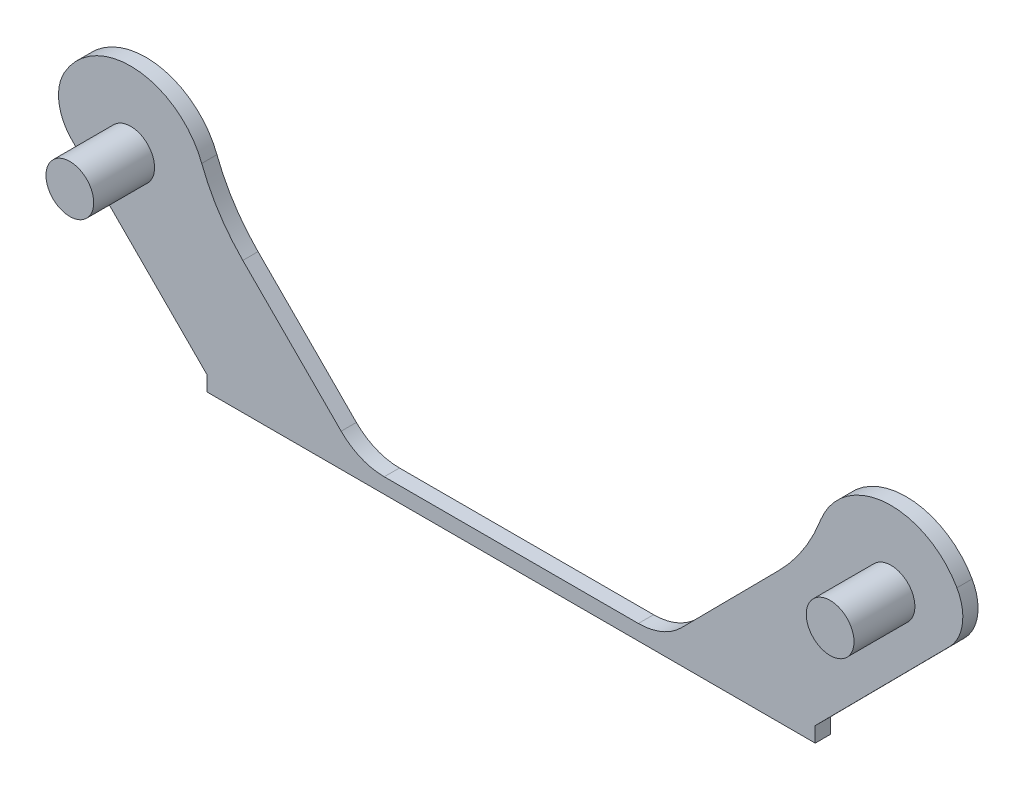
ISO-10303-21;
HEADER;
FILE_DESCRIPTION(('STEP AP214'),'2;1');
FILE_NAME('part.step','',(''),(''),'','','');
FILE_SCHEMA(('AUTOMOTIVE_DESIGN { 1 0 10303 214 1 1 1 1 }'));
ENDSEC;
DATA;
#1=APPLICATION_CONTEXT('core data for automotive mechanical design processes');
#2=APPLICATION_PROTOCOL_DEFINITION('international standard','automotive_design',2000,#1);
#3=PRODUCT_CONTEXT('',#1,'mechanical');
#4=PRODUCT('Part','Part','',(#3));
#5=PRODUCT_RELATED_PRODUCT_CATEGORY('part','',(#4));
#6=PRODUCT_DEFINITION_FORMATION('','',#4);
#7=PRODUCT_DEFINITION_CONTEXT('part definition',#1,'design');
#8=PRODUCT_DEFINITION('design','',#6,#7);
#9=PRODUCT_DEFINITION_SHAPE('','',#8);
#10=(LENGTH_UNIT() NAMED_UNIT(*) SI_UNIT(.MILLI.,.METRE.));
#11=(NAMED_UNIT(*) PLANE_ANGLE_UNIT() SI_UNIT($,.RADIAN.));
#12=(NAMED_UNIT(*) SI_UNIT($,.STERADIAN.) SOLID_ANGLE_UNIT());
#13=UNCERTAINTY_MEASURE_WITH_UNIT(LENGTH_MEASURE(1.E-05),#10,'distance_accuracy_value','');
#14=(GEOMETRIC_REPRESENTATION_CONTEXT(3) GLOBAL_UNCERTAINTY_ASSIGNED_CONTEXT((#13)) GLOBAL_UNIT_ASSIGNED_CONTEXT((#10,
#11,#12)) REPRESENTATION_CONTEXT('',''));
#15=CARTESIAN_POINT('',(0.,0.,0.));
#16=DIRECTION('',(0.,0.,1.));
#17=DIRECTION('',(1.,0.,0.));
#18=AXIS2_PLACEMENT_3D('',#15,#16,#17);
#19=CARTESIAN_POINT('',(63.4487157819452,28.0625247715558,12.7));
#20=DIRECTION('',(0.,0.,-1.));
#21=DIRECTION('',(-1.,0.,0.));
#22=AXIS2_PLACEMENT_3D('',#19,#20,#21);
#23=CYLINDRICAL_SURFACE('',#22,3.98780000000001);
#24=CARTESIAN_POINT('',(63.4487157819452,28.0625247715558,12.7));
#25=DIRECTION('',(0.,0.,1.));
#26=DIRECTION('',(1.,0.,0.));
#27=AXIS2_PLACEMENT_3D('',#24,#25,#26);
#28=CIRCLE('',#27,3.98780000000001);
#29=CARTESIAN_POINT('',(67.4365157819452,28.0625247715558,12.7));
#30=VERTEX_POINT('',#29);
#31=EDGE_CURVE('E11',#30,#30,#28,.T.);
#32=ORIENTED_EDGE('',*,*,#31,.F.);
#33=EDGE_LOOP('',(#32));
#34=FACE_BOUND('',#33,.T.);
#35=CARTESIAN_POINT('',(63.4487157819452,28.0625247715558,0.));
#36=DIRECTION('',(0.,0.,1.));
#37=DIRECTION('',(1.,0.,0.));
#38=AXIS2_PLACEMENT_3D('',#35,#36,#37);
#39=CIRCLE('',#38,3.98780000000001);
#40=CARTESIAN_POINT('',(67.4365157819452,28.0625247715558,0.));
#41=VERTEX_POINT('',#40);
#42=EDGE_CURVE('E51',#41,#41,#39,.T.);
#43=ORIENTED_EDGE('',*,*,#42,.T.);
#44=EDGE_LOOP('',(#43));
#45=FACE_BOUND('',#44,.T.);
#46=ADVANCED_FACE('F48',(#34,#45),#23,.T.);
#47=CARTESIAN_POINT('',(63.4487157819452,28.0625247715558,12.7));
#48=DIRECTION('',(0.,0.,1.));
#49=DIRECTION('',(1.,0.,0.));
#50=AXIS2_PLACEMENT_3D('',#47,#48,#49);
#51=PLANE('',#50);
#52=ORIENTED_EDGE('',*,*,#31,.T.);
#53=EDGE_LOOP('',(#52));
#54=FACE_BOUND('',#53,.T.);
#55=ADVANCED_FACE('F65',(#54),#51,.T.);
#56=CARTESIAN_POINT('',(63.4487157819452,28.0625247715558,0.));
#57=DIRECTION('',(0.,0.,1.));
#58=DIRECTION('',(1.,0.,0.));
#59=AXIS2_PLACEMENT_3D('',#56,#57,#58);
#60=PLANE('',#59);
#61=ORIENTED_EDGE('',*,*,#42,.F.);
#62=EDGE_LOOP('',(#61));
#63=FACE_BOUND('',#62,.T.);
#64=ADVANCED_FACE('F63',(#63),#60,.F.);
#65=CLOSED_SHELL('',(#46,#55,#64));
#66=MANIFOLD_SOLID_BREP('B2',#65);
#67=CARTESIAN_POINT('',(-63.5068121888884,28.0625247715558,12.7));
#68=DIRECTION('',(0.,0.,-1.));
#69=DIRECTION('',(-1.,0.,0.));
#70=AXIS2_PLACEMENT_3D('',#67,#68,#69);
#71=CYLINDRICAL_SURFACE('',#70,3.9878);
#72=CARTESIAN_POINT('',(-63.5068121888884,28.0625247715558,12.7));
#73=DIRECTION('',(0.,0.,1.));
#74=DIRECTION('',(1.,0.,0.));
#75=AXIS2_PLACEMENT_3D('',#72,#73,#74);
#76=CIRCLE('',#75,3.9878);
#77=CARTESIAN_POINT('',(-59.5190121888884,28.0625247715558,12.7));
#78=VERTEX_POINT('',#77);
#79=EDGE_CURVE('E47',#78,#78,#76,.T.);
#80=ORIENTED_EDGE('',*,*,#79,.F.);
#81=EDGE_LOOP('',(#80));
#82=FACE_BOUND('',#81,.T.);
#83=CARTESIAN_POINT('',(-63.5068121888884,28.0625247715558,0.));
#84=DIRECTION('',(0.,0.,1.));
#85=DIRECTION('',(1.,0.,0.));
#86=AXIS2_PLACEMENT_3D('',#83,#84,#85);
#87=CIRCLE('',#86,3.9878);
#88=CARTESIAN_POINT('',(-59.5190121888884,28.0625247715558,0.));
#89=VERTEX_POINT('',#88);
#90=EDGE_CURVE('E103',#89,#89,#87,.T.);
#91=ORIENTED_EDGE('',*,*,#90,.T.);
#92=EDGE_LOOP('',(#91));
#93=FACE_BOUND('',#92,.T.);
#94=ADVANCED_FACE('F100',(#82,#93),#71,.T.);
#95=CARTESIAN_POINT('',(-63.5068121888884,28.0625247715558,12.7));
#96=DIRECTION('',(0.,0.,1.));
#97=DIRECTION('',(1.,0.,0.));
#98=AXIS2_PLACEMENT_3D('',#95,#96,#97);
#99=PLANE('',#98);
#100=ORIENTED_EDGE('',*,*,#79,.T.);
#101=EDGE_LOOP('',(#100));
#102=FACE_BOUND('',#101,.T.);
#103=ADVANCED_FACE('F115',(#102),#99,.T.);
#104=CARTESIAN_POINT('',(-63.5068121888884,28.0625247715558,0.));
#105=DIRECTION('',(0.,0.,1.));
#106=DIRECTION('',(1.,0.,0.));
#107=AXIS2_PLACEMENT_3D('',#104,#105,#106);
#108=PLANE('',#107);
#109=ORIENTED_EDGE('',*,*,#90,.F.);
#110=EDGE_LOOP('',(#109));
#111=FACE_BOUND('',#110,.T.);
#112=ADVANCED_FACE('F113',(#111),#108,.F.);
#113=CLOSED_SHELL('',(#94,#103,#112));
#114=MANIFOLD_SOLID_BREP('B6',#113);
#115=CARTESIAN_POINT('',(-67.9414919541229,30.5543661840144,2.54));
#116=DIRECTION('',(0.,0.,-1.));
#117=DIRECTION('',(-1.,0.,0.));
#118=AXIS2_PLACEMENT_3D('',#115,#116,#117);
#119=PLANE('',#118);
#120=DIRECTION('',(0.703967938346691,0.710231752162566,0.));
#121=VECTOR('',#120,1.);
#122=CARTESIAN_POINT('',(73.2365339254354,25.1761712434539,2.54));
#123=LINE('',#122,#121);
#124=CARTESIAN_POINT('',(50.8,2.54,2.54));
#125=VERTEX_POINT('',#124);
#126=CARTESIAN_POINT('',(73.2365339254354,25.1761712434539,2.54));
#127=VERTEX_POINT('',#126);
#128=EDGE_CURVE('E317',#125,#127,#123,.T.);
#129=ORIENTED_EDGE('',*,*,#128,.T.);
#130=CARTESIAN_POINT('',(67.8245679739567,30.5404069336557,2.54));
#131=DIRECTION('',(0.,0.,1.));
#132=DIRECTION('',(-1.,0.,0.));
#133=AXIS2_PLACEMENT_3D('',#130,#131,#132);
#134=CIRCLE('',#133,7.61999999999999);
#135=CARTESIAN_POINT('',(74.4552854670479,34.2951353561671,2.54));
#136=VERTEX_POINT('',#135);
#137=EDGE_CURVE('E225',#127,#136,#134,.T.);
#138=ORIENTED_EDGE('',*,*,#137,.T.);
#139=CARTESIAN_POINT('',(63.4487157819452,28.0625247715558,2.54));
#140=DIRECTION('',(0.,0.,1.));
#141=DIRECTION('',(1.,0.,0.));
#142=AXIS2_PLACEMENT_3D('',#139,#140,#141);
#143=CIRCLE('',#142,12.6487157819452);
#144=CARTESIAN_POINT('',(51.6365188177206,32.5860205227193,2.54));
#145=VERTEX_POINT('',#144);
#146=EDGE_CURVE('E356',#136,#145,#143,.T.);
#147=ORIENTED_EDGE('',*,*,#146,.T.);
#148=CARTESIAN_POINT('',(23.1723039775485,43.4864275578958,2.54));
#149=DIRECTION('',(0.,0.,-1.));
#150=DIRECTION('',(1.,0.,0.));
#151=AXIS2_PLACEMENT_3D('',#148,#149,#150);
#152=CIRCLE('',#151,30.48);
#153=CARTESIAN_POINT('',(44.8201677834635,22.0294847970886,2.54));
#154=VERTEX_POINT('',#153);
#155=EDGE_CURVE('E375',#145,#154,#152,.T.);
#156=ORIENTED_EDGE('',*,*,#155,.T.);
#157=DIRECTION('',(-0.703967938346691,-0.710231752162567,0.));
#158=VECTOR('',#157,1.);
#159=CARTESIAN_POINT('',(44.8201677834635,22.0294847970886,2.54));
#160=LINE('',#159,#158);
#161=CARTESIAN_POINT('',(28.4837282161945,5.54768574639765,2.54));
#162=VERTEX_POINT('',#161);
#163=EDGE_CURVE('E372',#154,#162,#160,.T.);
#164=ORIENTED_EDGE('',*,*,#163,.T.);
#165=CARTESIAN_POINT('',(21.2677736142228,12.7,2.54));
#166=DIRECTION('',(0.,0.,-1.));
#167=DIRECTION('',(1.,0.,0.));
#168=AXIS2_PLACEMENT_3D('',#165,#166,#167);
#169=CIRCLE('',#168,10.16);
#170=CARTESIAN_POINT('',(21.2677736142228,2.54,2.54));
#171=VERTEX_POINT('',#170);
#172=EDGE_CURVE('E374',#162,#171,#169,.T.);
#173=ORIENTED_EDGE('',*,*,#172,.T.);
#174=DIRECTION('',(-1.,0.,0.));
#175=VECTOR('',#174,1.);
#176=CARTESIAN_POINT('',(21.2677736142228,2.54,2.54));
#177=LINE('',#176,#175);
#178=CARTESIAN_POINT('',(-21.1652358342087,2.53999999999999,2.54));
#179=VERTEX_POINT('',#178);
#180=EDGE_CURVE('E377',#171,#179,#177,.T.);
#181=ORIENTED_EDGE('',*,*,#180,.T.);
#182=CARTESIAN_POINT('',(-21.1652358342088,12.7,2.54));
#183=DIRECTION('',(0.,0.,-1.));
#184=DIRECTION('',(-1.,0.,0.));
#185=AXIS2_PLACEMENT_3D('',#182,#183,#184);
#186=CIRCLE('',#185,10.16);
#187=CARTESIAN_POINT('',(-28.3647839525823,5.53117116320775,2.54));
#188=VERTEX_POINT('',#187);
#189=EDGE_CURVE('E383',#179,#188,#186,.T.);
#190=ORIENTED_EDGE('',*,*,#189,.T.);
#191=DIRECTION('',(-0.705593389448058,0.708616940784794,0.));
#192=VECTOR('',#191,1.);
#193=CARTESIAN_POINT('',(-44.781504954116,22.0182397607809,2.54));
#194=LINE('',#193,#192);
#195=CARTESIAN_POINT('',(-44.781504954116,22.0182397607809,2.54));
#196=VERTEX_POINT('',#195);
#197=EDGE_CURVE('E385',#188,#196,#194,.T.);
#198=ORIENTED_EDGE('',*,*,#197,.T.);
#199=CARTESIAN_POINT('',(-23.1828605989955,43.5247262711577,2.54));
#200=DIRECTION('',(0.,0.,-1.));
#201=DIRECTION('',(-1.,0.,0.));
#202=AXIS2_PLACEMENT_3D('',#199,#200,#201);
#203=CIRCLE('',#202,30.48);
#204=CARTESIAN_POINT('',(-51.6423365863471,32.611952722451,2.54));
#205=VERTEX_POINT('',#204);
#206=EDGE_CURVE('E387',#196,#205,#203,.T.);
#207=ORIENTED_EDGE('',*,*,#206,.T.);
#208=CARTESIAN_POINT('',(-63.5068121888884,28.0625247715558,2.54));
#209=DIRECTION('',(0.,0.,1.));
#210=DIRECTION('',(-1.,0.,0.));
#211=AXIS2_PLACEMENT_3D('',#208,#209,#210);
#212=CIRCLE('',#211,12.7068121888884);
#213=CARTESIAN_POINT('',(-74.5846033087946,34.2871227431047,2.54));
#214=VERTEX_POINT('',#213);
#215=EDGE_CURVE('E389',#205,#214,#212,.T.);
#216=ORIENTED_EDGE('',*,*,#215,.T.);
#217=CARTESIAN_POINT('',(-67.9414919541229,30.5543661840144,2.54));
#218=DIRECTION('',(0.,0.,1.));
#219=DIRECTION('',(-1.,0.,0.));
#220=AXIS2_PLACEMENT_3D('',#217,#218,#219);
#221=CIRCLE('',#220,7.62000000000001);
#222=CARTESIAN_POINT('',(-73.3411530429031,25.1777445564201,2.54));
#223=VERTEX_POINT('',#222);
#224=EDGE_CURVE('E391',#214,#223,#221,.T.);
#225=ORIENTED_EDGE('',*,*,#224,.T.);
#226=DIRECTION('',(0.705593389448058,-0.708616940784794,0.));
#227=VECTOR('',#226,1.);
#228=CARTESIAN_POINT('',(-50.8,2.53999999999999,2.54));
#229=LINE('',#228,#227);
#230=CARTESIAN_POINT('',(-50.8,2.53999999999999,2.54));
#231=VERTEX_POINT('',#230);
#232=EDGE_CURVE('E268',#223,#231,#229,.T.);
#233=ORIENTED_EDGE('',*,*,#232,.T.);
#234=DIRECTION('',(0.,-1.,0.));
#235=VECTOR('',#234,1.);
#236=CARTESIAN_POINT('',(-50.8,2.53999999999999,2.54));
#237=LINE('',#236,#235);
#238=CARTESIAN_POINT('',(-50.8,0.,2.54));
#239=VERTEX_POINT('',#238);
#240=EDGE_CURVE('E262',#231,#239,#237,.T.);
#241=ORIENTED_EDGE('',*,*,#240,.T.);
#242=DIRECTION('',(1.,0.,0.));
#243=VECTOR('',#242,1.);
#244=CARTESIAN_POINT('',(50.8,0.,2.54));
#245=LINE('',#244,#243);
#246=CARTESIAN_POINT('',(50.8,0.,2.54));
#247=VERTEX_POINT('',#246);
#248=EDGE_CURVE('E266',#239,#247,#245,.T.);
#249=ORIENTED_EDGE('',*,*,#248,.T.);
#250=DIRECTION('',(0.,1.,0.));
#251=VECTOR('',#250,1.);
#252=CARTESIAN_POINT('',(50.8,2.54,2.54));
#253=LINE('',#252,#251);
#254=EDGE_CURVE('E158',#247,#125,#253,.T.);
#255=ORIENTED_EDGE('',*,*,#254,.T.);
#256=EDGE_LOOP('',(#129,#138,#147,#156,#164,#173,#181,#190,#198,#207,#216,#225,#233,#241,#249,#255));
#257=FACE_BOUND('',#256,.T.);
#258=CARTESIAN_POINT('',(-63.5068121888884,28.0625247715558,2.54));
#259=DIRECTION('',(0.,0.,1.));
#260=DIRECTION('',(1.,0.,0.));
#261=AXIS2_PLACEMENT_3D('',#258,#259,#260);
#262=CIRCLE('',#261,3.9878);
#263=CARTESIAN_POINT('',(-59.5190121888884,28.0625247715558,2.54));
#264=VERTEX_POINT('',#263);
#265=EDGE_CURVE('E290',#264,#264,#262,.T.);
#266=ORIENTED_EDGE('',*,*,#265,.F.);
#267=EDGE_LOOP('',(#266));
#268=FACE_BOUND('',#267,.T.);
#269=CARTESIAN_POINT('',(63.4487157819452,28.0625247715558,2.54));
#270=DIRECTION('',(0.,0.,1.));
#271=DIRECTION('',(1.,0.,0.));
#272=AXIS2_PLACEMENT_3D('',#269,#270,#271);
#273=CIRCLE('',#272,3.98780000000001);
#274=CARTESIAN_POINT('',(67.4365157819452,28.0625247715558,2.54));
#275=VERTEX_POINT('',#274);
#276=EDGE_CURVE('E432',#275,#275,#273,.T.);
#277=ORIENTED_EDGE('',*,*,#276,.F.);
#278=EDGE_LOOP('',(#277));
#279=FACE_BOUND('',#278,.T.);
#280=ADVANCED_FACE('F141',(#257,#268,#279),#119,.F.);
#281=CARTESIAN_POINT('',(-67.9414919541229,30.5543661840144,0.));
#282=DIRECTION('',(0.,0.,-1.));
#283=DIRECTION('',(-1.,0.,0.));
#284=AXIS2_PLACEMENT_3D('',#281,#282,#283);
#285=PLANE('',#284);
#286=CARTESIAN_POINT('',(-63.5068121888884,28.0625247715558,0.));
#287=DIRECTION('',(0.,0.,1.));
#288=DIRECTION('',(1.,0.,0.));
#289=AXIS2_PLACEMENT_3D('',#286,#287,#288);
#290=CIRCLE('',#289,3.9878);
#291=CARTESIAN_POINT('',(-59.5190121888884,28.0625247715558,0.));
#292=VERTEX_POINT('',#291);
#293=EDGE_CURVE('E437',#292,#292,#290,.T.);
#294=ORIENTED_EDGE('',*,*,#293,.T.);
#295=EDGE_LOOP('',(#294));
#296=FACE_BOUND('',#295,.T.);
#297=DIRECTION('',(0.703967938346691,0.710231752162566,0.));
#298=VECTOR('',#297,1.);
#299=CARTESIAN_POINT('',(73.2365339254354,25.1761712434539,0.));
#300=LINE('',#299,#298);
#301=CARTESIAN_POINT('',(50.8,2.54,0.));
#302=VERTEX_POINT('',#301);
#303=CARTESIAN_POINT('',(73.2365339254354,25.1761712434539,0.));
#304=VERTEX_POINT('',#303);
#305=EDGE_CURVE('E286',#302,#304,#300,.T.);
#306=ORIENTED_EDGE('',*,*,#305,.F.);
#307=DIRECTION('',(0.,1.,0.));
#308=VECTOR('',#307,1.);
#309=CARTESIAN_POINT('',(50.8,2.54,0.));
#310=LINE('',#309,#308);
#311=CARTESIAN_POINT('',(50.8,0.,0.));
#312=VERTEX_POINT('',#311);
#313=EDGE_CURVE('E217',#312,#302,#310,.T.);
#314=ORIENTED_EDGE('',*,*,#313,.F.);
#315=DIRECTION('',(1.,0.,0.));
#316=VECTOR('',#315,1.);
#317=CARTESIAN_POINT('',(50.8,0.,0.));
#318=LINE('',#317,#316);
#319=CARTESIAN_POINT('',(-50.8,0.,0.));
#320=VERTEX_POINT('',#319);
#321=EDGE_CURVE('E211',#320,#312,#318,.T.);
#322=ORIENTED_EDGE('',*,*,#321,.F.);
#323=DIRECTION('',(0.,-1.,0.));
#324=VECTOR('',#323,1.);
#325=CARTESIAN_POINT('',(-50.8,2.53999999999999,0.));
#326=LINE('',#325,#324);
#327=CARTESIAN_POINT('',(-50.8,2.53999999999999,0.));
#328=VERTEX_POINT('',#327);
#329=EDGE_CURVE('E276',#328,#320,#326,.T.);
#330=ORIENTED_EDGE('',*,*,#329,.F.);
#331=DIRECTION('',(0.705593389448058,-0.708616940784794,0.));
#332=VECTOR('',#331,1.);
#333=CARTESIAN_POINT('',(-50.8,2.53999999999999,0.));
#334=LINE('',#333,#332);
#335=CARTESIAN_POINT('',(-73.3411530429031,25.1777445564201,0.));
#336=VERTEX_POINT('',#335);
#337=EDGE_CURVE('E312',#336,#328,#334,.T.);
#338=ORIENTED_EDGE('',*,*,#337,.F.);
#339=CARTESIAN_POINT('',(-67.9414919541229,30.5543661840144,0.));
#340=DIRECTION('',(0.,0.,1.));
#341=DIRECTION('',(-1.,0.,0.));
#342=AXIS2_PLACEMENT_3D('',#339,#340,#341);
#343=CIRCLE('',#342,7.62000000000001);
#344=CARTESIAN_POINT('',(-74.5846033087946,34.2871227431047,0.));
#345=VERTEX_POINT('',#344);
#346=EDGE_CURVE('E310',#345,#336,#343,.T.);
#347=ORIENTED_EDGE('',*,*,#346,.F.);
#348=CARTESIAN_POINT('',(-63.5068121888884,28.0625247715558,0.));
#349=DIRECTION('',(0.,0.,1.));
#350=DIRECTION('',(-1.,0.,0.));
#351=AXIS2_PLACEMENT_3D('',#348,#349,#350);
#352=CIRCLE('',#351,12.7068121888884);
#353=CARTESIAN_POINT('',(-51.6423365863471,32.611952722451,0.));
#354=VERTEX_POINT('',#353);
#355=EDGE_CURVE('E308',#354,#345,#352,.T.);
#356=ORIENTED_EDGE('',*,*,#355,.F.);
#357=CARTESIAN_POINT('',(-23.1828605989955,43.5247262711577,0.));
#358=DIRECTION('',(0.,0.,-1.));
#359=DIRECTION('',(-1.,0.,0.));
#360=AXIS2_PLACEMENT_3D('',#357,#358,#359);
#361=CIRCLE('',#360,30.48);
#362=CARTESIAN_POINT('',(-44.781504954116,22.0182397607809,0.));
#363=VERTEX_POINT('',#362);
#364=EDGE_CURVE('E306',#363,#354,#361,.T.);
#365=ORIENTED_EDGE('',*,*,#364,.F.);
#366=DIRECTION('',(-0.705593389448058,0.708616940784794,0.));
#367=VECTOR('',#366,1.);
#368=CARTESIAN_POINT('',(-44.781504954116,22.0182397607809,0.));
#369=LINE('',#368,#367);
#370=CARTESIAN_POINT('',(-28.3647839525823,5.53117116320775,0.));
#371=VERTEX_POINT('',#370);
#372=EDGE_CURVE('E304',#371,#363,#369,.T.);
#373=ORIENTED_EDGE('',*,*,#372,.F.);
#374=CARTESIAN_POINT('',(-21.1652358342088,12.7,0.));
#375=DIRECTION('',(0.,0.,-1.));
#376=DIRECTION('',(-1.,0.,0.));
#377=AXIS2_PLACEMENT_3D('',#374,#375,#376);
#378=CIRCLE('',#377,10.16);
#379=CARTESIAN_POINT('',(-21.1652358342087,2.53999999999999,0.));
#380=VERTEX_POINT('',#379);
#381=EDGE_CURVE('E302',#380,#371,#378,.T.);
#382=ORIENTED_EDGE('',*,*,#381,.F.);
#383=DIRECTION('',(-1.,0.,0.));
#384=VECTOR('',#383,1.);
#385=CARTESIAN_POINT('',(21.2677736142228,2.54,0.));
#386=LINE('',#385,#384);
#387=CARTESIAN_POINT('',(21.2677736142228,2.54,0.));
#388=VERTEX_POINT('',#387);
#389=EDGE_CURVE('E300',#388,#380,#386,.T.);
#390=ORIENTED_EDGE('',*,*,#389,.F.);
#391=CARTESIAN_POINT('',(21.2677736142228,12.7,0.));
#392=DIRECTION('',(0.,0.,-1.));
#393=DIRECTION('',(1.,0.,0.));
#394=AXIS2_PLACEMENT_3D('',#391,#392,#393);
#395=CIRCLE('',#394,10.16);
#396=CARTESIAN_POINT('',(28.4837282161945,5.54768574639765,0.));
#397=VERTEX_POINT('',#396);
#398=EDGE_CURVE('E298',#397,#388,#395,.T.);
#399=ORIENTED_EDGE('',*,*,#398,.F.);
#400=DIRECTION('',(-0.703967938346691,-0.710231752162567,0.));
#401=VECTOR('',#400,1.);
#402=CARTESIAN_POINT('',(44.8201677834635,22.0294847970886,0.));
#403=LINE('',#402,#401);
#404=CARTESIAN_POINT('',(44.8201677834635,22.0294847970886,0.));
#405=VERTEX_POINT('',#404);
#406=EDGE_CURVE('E296',#405,#397,#403,.T.);
#407=ORIENTED_EDGE('',*,*,#406,.F.);
#408=CARTESIAN_POINT('',(23.1723039775485,43.4864275578958,0.));
#409=DIRECTION('',(0.,0.,-1.));
#410=DIRECTION('',(1.,0.,0.));
#411=AXIS2_PLACEMENT_3D('',#408,#409,#410);
#412=CIRCLE('',#411,30.48);
#413=CARTESIAN_POINT('',(51.6365188177206,32.5860205227193,0.));
#414=VERTEX_POINT('',#413);
#415=EDGE_CURVE('E294',#414,#405,#412,.T.);
#416=ORIENTED_EDGE('',*,*,#415,.F.);
#417=CARTESIAN_POINT('',(63.4487157819452,28.0625247715558,0.));
#418=DIRECTION('',(0.,0.,1.));
#419=DIRECTION('',(1.,0.,0.));
#420=AXIS2_PLACEMENT_3D('',#417,#418,#419);
#421=CIRCLE('',#420,12.6487157819452);
#422=CARTESIAN_POINT('',(74.4552854670479,34.2951353561671,0.));
#423=VERTEX_POINT('',#422);
#424=EDGE_CURVE('E292',#423,#414,#421,.T.);
#425=ORIENTED_EDGE('',*,*,#424,.F.);
#426=CARTESIAN_POINT('',(67.8245679739567,30.5404069336557,0.));
#427=DIRECTION('',(0.,0.,1.));
#428=DIRECTION('',(-1.,0.,0.));
#429=AXIS2_PLACEMENT_3D('',#426,#427,#428);
#430=CIRCLE('',#429,7.61999999999999);
#431=EDGE_CURVE('E289',#304,#423,#430,.T.);
#432=ORIENTED_EDGE('',*,*,#431,.F.);
#433=EDGE_LOOP('',(#306,#314,#322,#330,#338,#347,#356,#365,#373,#382,#390,#399,#407,#416,#425,#432));
#434=FACE_BOUND('',#433,.T.);
#435=CARTESIAN_POINT('',(63.4487157819452,28.0625247715558,0.));
#436=DIRECTION('',(0.,0.,1.));
#437=DIRECTION('',(1.,0.,0.));
#438=AXIS2_PLACEMENT_3D('',#435,#436,#437);
#439=CIRCLE('',#438,3.98780000000001);
#440=CARTESIAN_POINT('',(67.4365157819452,28.0625247715558,0.));
#441=VERTEX_POINT('',#440);
#442=EDGE_CURVE('E435',#441,#441,#439,.T.);
#443=ORIENTED_EDGE('',*,*,#442,.T.);
#444=EDGE_LOOP('',(#443));
#445=FACE_BOUND('',#444,.T.);
#446=ADVANCED_FACE('F360',(#296,#434,#445),#285,.T.);
#447=CARTESIAN_POINT('',(73.2365339254354,25.1761712434539,2.54));
#448=DIRECTION('',(-0.710231752162567,0.703967938346691,0.));
#449=DIRECTION('',(-0.703967938346691,-0.710231752162567,0.));
#450=AXIS2_PLACEMENT_3D('',#447,#448,#449);
#451=PLANE('',#450);
#452=ORIENTED_EDGE('',*,*,#305,.T.);
#453=DIRECTION('',(0.,0.,-1.));
#454=VECTOR('',#453,1.);
#455=CARTESIAN_POINT('',(73.2365339254354,25.1761712434539,2.54));
#456=LINE('',#455,#454);
#457=EDGE_CURVE('E98',#127,#304,#456,.T.);
#458=ORIENTED_EDGE('',*,*,#457,.F.);
#459=ORIENTED_EDGE('',*,*,#128,.F.);
#460=DIRECTION('',(0.,0.,-1.));
#461=VECTOR('',#460,1.);
#462=CARTESIAN_POINT('',(50.8,2.54,2.54));
#463=LINE('',#462,#461);
#464=EDGE_CURVE('E282',#125,#302,#463,.T.);
#465=ORIENTED_EDGE('',*,*,#464,.T.);
#466=EDGE_LOOP('',(#452,#458,#459,#465));
#467=FACE_BOUND('',#466,.T.);
#468=ADVANCED_FACE('F143',(#467),#451,.F.);
#469=CARTESIAN_POINT('',(67.8245679739567,30.5404069336557,2.54));
#470=DIRECTION('',(0.,0.,-1.));
#471=DIRECTION('',(-1.,0.,0.));
#472=AXIS2_PLACEMENT_3D('',#469,#470,#471);
#473=CYLINDRICAL_SURFACE('',#472,7.61999999999999);
#474=ORIENTED_EDGE('',*,*,#431,.T.);
#475=DIRECTION('',(0.,0.,-1.));
#476=VECTOR('',#475,1.);
#477=CARTESIAN_POINT('',(74.4552854670479,34.2951353561671,2.54));
#478=LINE('',#477,#476);
#479=EDGE_CURVE('E150',#136,#423,#478,.T.);
#480=ORIENTED_EDGE('',*,*,#479,.F.);
#481=ORIENTED_EDGE('',*,*,#137,.F.);
#482=ORIENTED_EDGE('',*,*,#457,.T.);
#483=EDGE_LOOP('',(#474,#480,#481,#482));
#484=FACE_BOUND('',#483,.T.);
#485=ADVANCED_FACE('F572',(#484),#473,.T.);
#486=CARTESIAN_POINT('',(63.4487157819452,28.0625247715558,2.54));
#487=DIRECTION('',(0.,0.,-1.));
#488=DIRECTION('',(-1.,0.,0.));
#489=AXIS2_PLACEMENT_3D('',#486,#487,#488);
#490=CYLINDRICAL_SURFACE('',#489,12.6487157819452);
#491=ORIENTED_EDGE('',*,*,#424,.T.);
#492=DIRECTION('',(0.,0.,-1.));
#493=VECTOR('',#492,1.);
#494=CARTESIAN_POINT('',(51.6365188177206,32.5860205227193,2.54));
#495=LINE('',#494,#493);
#496=EDGE_CURVE('E348',#145,#414,#495,.T.);
#497=ORIENTED_EDGE('',*,*,#496,.F.);
#498=ORIENTED_EDGE('',*,*,#146,.F.);
#499=ORIENTED_EDGE('',*,*,#479,.T.);
#500=EDGE_LOOP('',(#491,#497,#498,#499));
#501=FACE_BOUND('',#500,.T.);
#502=ADVANCED_FACE('F354',(#501),#490,.T.);
#503=CARTESIAN_POINT('',(23.1723039775485,43.4864275578958,2.54));
#504=DIRECTION('',(0.,0.,-1.));
#505=DIRECTION('',(-1.,0.,0.));
#506=AXIS2_PLACEMENT_3D('',#503,#504,#505);
#507=CYLINDRICAL_SURFACE('',#506,30.48);
#508=ORIENTED_EDGE('',*,*,#415,.T.);
#509=DIRECTION('',(0.,0.,-1.));
#510=VECTOR('',#509,1.);
#511=CARTESIAN_POINT('',(44.8201677834635,22.0294847970886,2.54));
#512=LINE('',#511,#510);
#513=EDGE_CURVE('E345',#154,#405,#512,.T.);
#514=ORIENTED_EDGE('',*,*,#513,.F.);
#515=ORIENTED_EDGE('',*,*,#155,.F.);
#516=ORIENTED_EDGE('',*,*,#496,.T.);
#517=EDGE_LOOP('',(#508,#514,#515,#516));
#518=FACE_BOUND('',#517,.T.);
#519=ADVANCED_FACE('F366',(#518),#507,.F.);
#520=CARTESIAN_POINT('',(44.8201677834635,22.0294847970886,2.54));
#521=DIRECTION('',(0.710231752162567,-0.703967938346691,0.));
#522=DIRECTION('',(0.703967938346691,0.710231752162567,0.));
#523=AXIS2_PLACEMENT_3D('',#520,#521,#522);
#524=PLANE('',#523);
#525=ORIENTED_EDGE('',*,*,#406,.T.);
#526=DIRECTION('',(0.,0.,-1.));
#527=VECTOR('',#526,1.);
#528=CARTESIAN_POINT('',(28.4837282161945,5.54768574639765,2.54));
#529=LINE('',#528,#527);
#530=EDGE_CURVE('E342',#162,#397,#529,.T.);
#531=ORIENTED_EDGE('',*,*,#530,.F.);
#532=ORIENTED_EDGE('',*,*,#163,.F.);
#533=ORIENTED_EDGE('',*,*,#513,.T.);
#534=EDGE_LOOP('',(#525,#531,#532,#533));
#535=FACE_BOUND('',#534,.T.);
#536=ADVANCED_FACE('F370',(#535),#524,.F.);
#537=CARTESIAN_POINT('',(21.2677736142228,12.7,2.54));
#538=DIRECTION('',(0.,0.,-1.));
#539=DIRECTION('',(-1.,0.,0.));
#540=AXIS2_PLACEMENT_3D('',#537,#538,#539);
#541=CYLINDRICAL_SURFACE('',#540,10.16);
#542=ORIENTED_EDGE('',*,*,#398,.T.);
#543=DIRECTION('',(0.,0.,-1.));
#544=VECTOR('',#543,1.);
#545=CARTESIAN_POINT('',(21.2677736142228,2.54,2.54));
#546=LINE('',#545,#544);
#547=EDGE_CURVE('E339',#171,#388,#546,.T.);
#548=ORIENTED_EDGE('',*,*,#547,.F.);
#549=ORIENTED_EDGE('',*,*,#172,.F.);
#550=ORIENTED_EDGE('',*,*,#530,.T.);
#551=EDGE_LOOP('',(#542,#548,#549,#550));
#552=FACE_BOUND('',#551,.T.);
#553=ADVANCED_FACE('F537',(#552),#541,.F.);
#554=CARTESIAN_POINT('',(21.2677736142228,2.54,2.54));
#555=DIRECTION('',(0.,-1.,0.));
#556=DIRECTION('',(1.,0.,0.));
#557=AXIS2_PLACEMENT_3D('',#554,#555,#556);
#558=PLANE('',#557);
#559=ORIENTED_EDGE('',*,*,#389,.T.);
#560=DIRECTION('',(0.,0.,-1.));
#561=VECTOR('',#560,1.);
#562=CARTESIAN_POINT('',(-21.1652358342087,2.53999999999999,2.54));
#563=LINE('',#562,#561);
#564=EDGE_CURVE('E336',#179,#380,#563,.T.);
#565=ORIENTED_EDGE('',*,*,#564,.F.);
#566=ORIENTED_EDGE('',*,*,#180,.F.);
#567=ORIENTED_EDGE('',*,*,#547,.T.);
#568=EDGE_LOOP('',(#559,#565,#566,#567));
#569=FACE_BOUND('',#568,.T.);
#570=ADVANCED_FACE('F527',(#569),#558,.F.);
#571=CARTESIAN_POINT('',(-21.1652358342088,12.7,2.54));
#572=DIRECTION('',(0.,0.,-1.));
#573=DIRECTION('',(-1.,0.,0.));
#574=AXIS2_PLACEMENT_3D('',#571,#572,#573);
#575=CYLINDRICAL_SURFACE('',#574,10.16);
#576=ORIENTED_EDGE('',*,*,#381,.T.);
#577=DIRECTION('',(0.,0.,-1.));
#578=VECTOR('',#577,1.);
#579=CARTESIAN_POINT('',(-28.3647839525823,5.53117116320775,2.54));
#580=LINE('',#579,#578);
#581=EDGE_CURVE('E333',#188,#371,#580,.T.);
#582=ORIENTED_EDGE('',*,*,#581,.F.);
#583=ORIENTED_EDGE('',*,*,#189,.F.);
#584=ORIENTED_EDGE('',*,*,#564,.T.);
#585=EDGE_LOOP('',(#576,#582,#583,#584));
#586=FACE_BOUND('',#585,.T.);
#587=ADVANCED_FACE('F517',(#586),#575,.F.);
#588=CARTESIAN_POINT('',(-44.781504954116,22.0182397607809,2.54));
#589=DIRECTION('',(-0.708616940784794,-0.705593389448058,0.));
#590=DIRECTION('',(0.705593389448058,-0.708616940784794,0.));
#591=AXIS2_PLACEMENT_3D('',#588,#589,#590);
#592=PLANE('',#591);
#593=ORIENTED_EDGE('',*,*,#372,.T.);
#594=DIRECTION('',(0.,0.,-1.));
#595=VECTOR('',#594,1.);
#596=CARTESIAN_POINT('',(-44.781504954116,22.0182397607809,2.54));
#597=LINE('',#596,#595);
#598=EDGE_CURVE('E330',#196,#363,#597,.T.);
#599=ORIENTED_EDGE('',*,*,#598,.F.);
#600=ORIENTED_EDGE('',*,*,#197,.F.);
#601=ORIENTED_EDGE('',*,*,#581,.T.);
#602=EDGE_LOOP('',(#593,#599,#600,#601));
#603=FACE_BOUND('',#602,.T.);
#604=ADVANCED_FACE('F507',(#603),#592,.F.);
#605=CARTESIAN_POINT('',(-23.1828605989955,43.5247262711577,2.54));
#606=DIRECTION('',(0.,0.,-1.));
#607=DIRECTION('',(-1.,0.,0.));
#608=AXIS2_PLACEMENT_3D('',#605,#606,#607);
#609=CYLINDRICAL_SURFACE('',#608,30.48);
#610=ORIENTED_EDGE('',*,*,#364,.T.);
#611=DIRECTION('',(0.,0.,-1.));
#612=VECTOR('',#611,1.);
#613=CARTESIAN_POINT('',(-51.6423365863471,32.611952722451,2.54));
#614=LINE('',#613,#612);
#615=EDGE_CURVE('E327',#205,#354,#614,.T.);
#616=ORIENTED_EDGE('',*,*,#615,.F.);
#617=ORIENTED_EDGE('',*,*,#206,.F.);
#618=ORIENTED_EDGE('',*,*,#598,.T.);
#619=EDGE_LOOP('',(#610,#616,#617,#618));
#620=FACE_BOUND('',#619,.T.);
#621=ADVANCED_FACE('F497',(#620),#609,.F.);
#622=CARTESIAN_POINT('',(-63.5068121888884,28.0625247715558,2.54));
#623=DIRECTION('',(0.,0.,-1.));
#624=DIRECTION('',(-1.,0.,0.));
#625=AXIS2_PLACEMENT_3D('',#622,#623,#624);
#626=CYLINDRICAL_SURFACE('',#625,12.7068121888884);
#627=ORIENTED_EDGE('',*,*,#355,.T.);
#628=DIRECTION('',(0.,0.,-1.));
#629=VECTOR('',#628,1.);
#630=CARTESIAN_POINT('',(-74.5846033087946,34.2871227431047,2.54));
#631=LINE('',#630,#629);
#632=EDGE_CURVE('E324',#214,#345,#631,.T.);
#633=ORIENTED_EDGE('',*,*,#632,.F.);
#634=ORIENTED_EDGE('',*,*,#215,.F.);
#635=ORIENTED_EDGE('',*,*,#615,.T.);
#636=EDGE_LOOP('',(#627,#633,#634,#635));
#637=FACE_BOUND('',#636,.T.);
#638=ADVANCED_FACE('F488',(#637),#626,.T.);
#639=CARTESIAN_POINT('',(-67.9414919541229,30.5543661840144,2.54));
#640=DIRECTION('',(0.,0.,-1.));
#641=DIRECTION('',(-1.,0.,0.));
#642=AXIS2_PLACEMENT_3D('',#639,#640,#641);
#643=CYLINDRICAL_SURFACE('',#642,7.62000000000001);
#644=ORIENTED_EDGE('',*,*,#346,.T.);
#645=DIRECTION('',(0.,0.,-1.));
#646=VECTOR('',#645,1.);
#647=CARTESIAN_POINT('',(-73.3411530429031,25.1777445564201,2.54));
#648=LINE('',#647,#646);
#649=EDGE_CURVE('E321',#223,#336,#648,.T.);
#650=ORIENTED_EDGE('',*,*,#649,.F.);
#651=ORIENTED_EDGE('',*,*,#224,.F.);
#652=ORIENTED_EDGE('',*,*,#632,.T.);
#653=EDGE_LOOP('',(#644,#650,#651,#652));
#654=FACE_BOUND('',#653,.T.);
#655=ADVANCED_FACE('F397',(#654),#643,.T.);
#656=CARTESIAN_POINT('',(-50.8,2.53999999999999,2.54));
#657=DIRECTION('',(0.708616940784794,0.705593389448058,0.));
#658=DIRECTION('',(-0.705593389448058,0.708616940784794,0.));
#659=AXIS2_PLACEMENT_3D('',#656,#657,#658);
#660=PLANE('',#659);
#661=ORIENTED_EDGE('',*,*,#337,.T.);
#662=DIRECTION('',(0.,0.,-1.));
#663=VECTOR('',#662,1.);
#664=CARTESIAN_POINT('',(-50.8,2.53999999999999,2.54));
#665=LINE('',#664,#663);
#666=EDGE_CURVE('E277',#231,#328,#665,.T.);
#667=ORIENTED_EDGE('',*,*,#666,.F.);
#668=ORIENTED_EDGE('',*,*,#232,.F.);
#669=ORIENTED_EDGE('',*,*,#649,.T.);
#670=EDGE_LOOP('',(#661,#667,#668,#669));
#671=FACE_BOUND('',#670,.T.);
#672=ADVANCED_FACE('F401',(#671),#660,.F.);
#673=CARTESIAN_POINT('',(-50.8,2.53999999999999,2.54));
#674=DIRECTION('',(1.,0.,0.));
#675=DIRECTION('',(0.,1.,0.));
#676=AXIS2_PLACEMENT_3D('',#673,#674,#675);
#677=PLANE('',#676);
#678=ORIENTED_EDGE('',*,*,#329,.T.);
#679=DIRECTION('',(0.,0.,-1.));
#680=VECTOR('',#679,1.);
#681=CARTESIAN_POINT('',(-50.8,0.,2.54));
#682=LINE('',#681,#680);
#683=EDGE_CURVE('E273',#239,#320,#682,.T.);
#684=ORIENTED_EDGE('',*,*,#683,.F.);
#685=ORIENTED_EDGE('',*,*,#240,.F.);
#686=ORIENTED_EDGE('',*,*,#666,.T.);
#687=EDGE_LOOP('',(#678,#684,#685,#686));
#688=FACE_BOUND('',#687,.T.);
#689=ADVANCED_FACE('F274',(#688),#677,.F.);
#690=CARTESIAN_POINT('',(50.8,0.,2.54));
#691=DIRECTION('',(0.,1.,0.));
#692=DIRECTION('',(0.,0.,1.));
#693=AXIS2_PLACEMENT_3D('',#690,#691,#692);
#694=PLANE('',#693);
#695=ORIENTED_EDGE('',*,*,#321,.T.);
#696=DIRECTION('',(0.,0.,-1.));
#697=VECTOR('',#696,1.);
#698=CARTESIAN_POINT('',(50.8,0.,2.54));
#699=LINE('',#698,#697);
#700=EDGE_CURVE('E278',#247,#312,#699,.T.);
#701=ORIENTED_EDGE('',*,*,#700,.F.);
#702=ORIENTED_EDGE('',*,*,#248,.F.);
#703=ORIENTED_EDGE('',*,*,#683,.T.);
#704=EDGE_LOOP('',(#695,#701,#702,#703));
#705=FACE_BOUND('',#704,.T.);
#706=ADVANCED_FACE('F280',(#705),#694,.F.);
#707=CARTESIAN_POINT('',(50.8,2.54,2.54));
#708=DIRECTION('',(-1.,0.,0.));
#709=DIRECTION('',(0.,-1.,0.));
#710=AXIS2_PLACEMENT_3D('',#707,#708,#709);
#711=PLANE('',#710);
#712=ORIENTED_EDGE('',*,*,#313,.T.);
#713=ORIENTED_EDGE('',*,*,#464,.F.);
#714=ORIENTED_EDGE('',*,*,#254,.F.);
#715=ORIENTED_EDGE('',*,*,#700,.T.);
#716=EDGE_LOOP('',(#712,#713,#714,#715));
#717=FACE_BOUND('',#716,.T.);
#718=ADVANCED_FACE('F405',(#717),#711,.F.);
#719=CARTESIAN_POINT('',(-63.5068121888884,28.0625247715558,2.54));
#720=DIRECTION('',(0.,0.,-1.));
#721=DIRECTION('',(-1.,0.,0.));
#722=AXIS2_PLACEMENT_3D('',#719,#720,#721);
#723=CYLINDRICAL_SURFACE('',#722,3.9878);
#724=ORIENTED_EDGE('',*,*,#265,.T.);
#725=EDGE_LOOP('',(#724));
#726=FACE_BOUND('',#725,.T.);
#727=ORIENTED_EDGE('',*,*,#293,.F.);
#728=EDGE_LOOP('',(#727));
#729=FACE_BOUND('',#728,.T.);
#730=ADVANCED_FACE('F407',(#726,#729),#723,.F.);
#731=CARTESIAN_POINT('',(63.4487157819452,28.0625247715558,2.54));
#732=DIRECTION('',(0.,0.,-1.));
#733=DIRECTION('',(-1.,0.,0.));
#734=AXIS2_PLACEMENT_3D('',#731,#732,#733);
#735=CYLINDRICAL_SURFACE('',#734,3.98780000000001);
#736=ORIENTED_EDGE('',*,*,#276,.T.);
#737=EDGE_LOOP('',(#736));
#738=FACE_BOUND('',#737,.T.);
#739=ORIENTED_EDGE('',*,*,#442,.F.);
#740=EDGE_LOOP('',(#739));
#741=FACE_BOUND('',#740,.T.);
#742=ADVANCED_FACE('F413',(#738,#741),#735,.F.);
#743=CLOSED_SHELL('',(#280,#446,#468,#485,#502,#519,#536,#553,#570,#587,#604,#621,#638,#655,
#672,#689,#706,#718,#730,#742));
#744=MANIFOLD_SOLID_BREP('B42',#743);
#745=ADVANCED_BREP_SHAPE_REPRESENTATION('',(#18,#66,#114,#744),#14);
#746=SHAPE_DEFINITION_REPRESENTATION(#9,#745);
ENDSEC;
END-ISO-10303-21;
